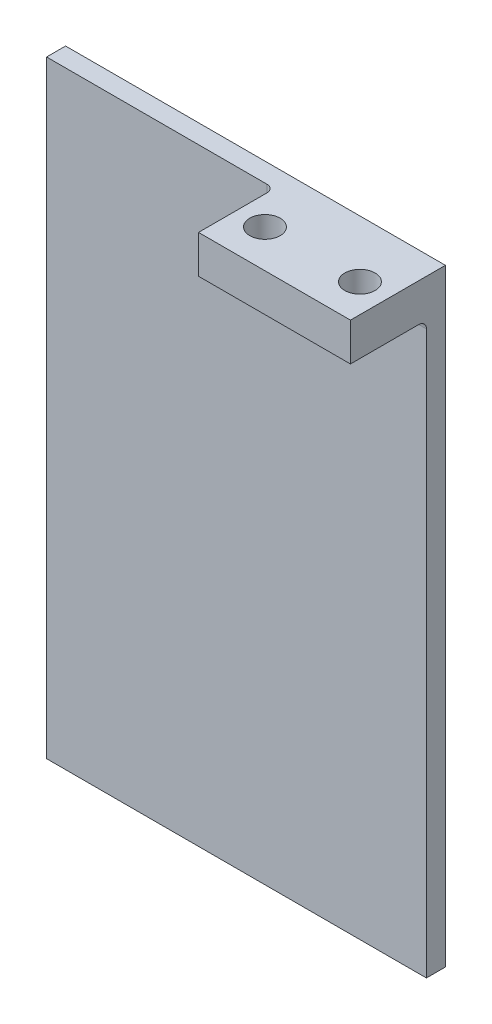
ISO-10303-21;
HEADER;
FILE_DESCRIPTION(('STEP AP214'),'2;1');
FILE_NAME('part.step','',(''),(''),'','','');
FILE_SCHEMA(('AUTOMOTIVE_DESIGN { 1 0 10303 214 1 1 1 1 }'));
ENDSEC;
DATA;
#1=APPLICATION_CONTEXT('core data for automotive mechanical design processes');
#2=APPLICATION_PROTOCOL_DEFINITION('international standard','automotive_design',2000,#1);
#3=PRODUCT_CONTEXT('',#1,'mechanical');
#4=PRODUCT('Part','Part','',(#3));
#5=PRODUCT_RELATED_PRODUCT_CATEGORY('part','',(#4));
#6=PRODUCT_DEFINITION_FORMATION('','',#4);
#7=PRODUCT_DEFINITION_CONTEXT('part definition',#1,'design');
#8=PRODUCT_DEFINITION('design','',#6,#7);
#9=PRODUCT_DEFINITION_SHAPE('','',#8);
#10=(LENGTH_UNIT() NAMED_UNIT(*) SI_UNIT(.MILLI.,.METRE.));
#11=(NAMED_UNIT(*) PLANE_ANGLE_UNIT() SI_UNIT($,.RADIAN.));
#12=(NAMED_UNIT(*) SI_UNIT($,.STERADIAN.) SOLID_ANGLE_UNIT());
#13=UNCERTAINTY_MEASURE_WITH_UNIT(LENGTH_MEASURE(1.E-05),#10,'distance_accuracy_value','');
#14=(GEOMETRIC_REPRESENTATION_CONTEXT(3) GLOBAL_UNCERTAINTY_ASSIGNED_CONTEXT((#13)) GLOBAL_UNIT_ASSIGNED_CONTEXT((#10,
#11,#12)) REPRESENTATION_CONTEXT('',''));
#15=CARTESIAN_POINT('',(0.,0.,0.));
#16=DIRECTION('',(0.,0.,1.));
#17=DIRECTION('',(1.,0.,0.));
#18=AXIS2_PLACEMENT_3D('',#15,#16,#17);
#19=CARTESIAN_POINT('',(0.,0.,5.));
#20=DIRECTION('',(0.,0.,1.));
#21=DIRECTION('',(1.,0.,0.));
#22=AXIS2_PLACEMENT_3D('',#19,#20,#21);
#23=PLANE('',#22);
#24=DIRECTION('',(-1.,0.,0.));
#25=VECTOR('',#24,1.);
#26=CARTESIAN_POINT('',(9.99999999999999,68.,5.));
#27=LINE('',#26,#25);
#28=CARTESIAN_POINT('',(50.,68.,5.));
#29=VERTEX_POINT('',#28);
#30=CARTESIAN_POINT('',(7.99999999999999,68.,5.));
#31=VERTEX_POINT('',#30);
#32=EDGE_CURVE('E181',#29,#31,#27,.T.);
#33=ORIENTED_EDGE('',*,*,#32,.T.);
#34=DIRECTION('',(0.,1.,0.));
#35=VECTOR('',#34,1.);
#36=CARTESIAN_POINT('',(7.99999999999999,80.,5.));
#37=LINE('',#36,#35);
#38=CARTESIAN_POINT('',(7.99999999999999,80.,5.));
#39=VERTEX_POINT('',#38);
#40=EDGE_CURVE('E184',#31,#39,#37,.T.);
#41=ORIENTED_EDGE('',*,*,#40,.T.);
#42=DIRECTION('',(-1.,0.,0.));
#43=VECTOR('',#42,1.);
#44=CARTESIAN_POINT('',(-50.,80.,5.));
#45=LINE('',#44,#43);
#46=CARTESIAN_POINT('',(-50.,80.,5.));
#47=VERTEX_POINT('',#46);
#48=EDGE_CURVE('E144',#39,#47,#45,.T.);
#49=ORIENTED_EDGE('',*,*,#48,.T.);
#50=DIRECTION('',(0.,-1.,0.));
#51=VECTOR('',#50,1.);
#52=CARTESIAN_POINT('',(-50.,80.,5.));
#53=LINE('',#52,#51);
#54=CARTESIAN_POINT('',(-50.,-80.,5.));
#55=VERTEX_POINT('',#54);
#56=EDGE_CURVE('E148',#47,#55,#53,.T.);
#57=ORIENTED_EDGE('',*,*,#56,.T.);
#58=DIRECTION('',(1.,0.,0.));
#59=VECTOR('',#58,1.);
#60=CARTESIAN_POINT('',(-50.,-80.,5.));
#61=LINE('',#60,#59);
#62=CARTESIAN_POINT('',(50.,-80.,5.));
#63=VERTEX_POINT('',#62);
#64=EDGE_CURVE('E151',#55,#63,#61,.T.);
#65=ORIENTED_EDGE('',*,*,#64,.T.);
#66=DIRECTION('',(0.,1.,0.));
#67=VECTOR('',#66,1.);
#68=CARTESIAN_POINT('',(50.,80.,5.));
#69=LINE('',#68,#67);
#70=EDGE_CURVE('E140',#63,#29,#69,.T.);
#71=ORIENTED_EDGE('',*,*,#70,.T.);
#72=EDGE_LOOP('',(#33,#41,#49,#57,#65,#71));
#73=FACE_BOUND('',#72,.T.);
#74=ADVANCED_FACE('F38',(#73),#23,.T.);
#75=CARTESIAN_POINT('',(50.,80.,5.));
#76=DIRECTION('',(-1.,0.,0.));
#77=DIRECTION('',(0.,0.,1.));
#78=AXIS2_PLACEMENT_3D('',#75,#76,#77);
#79=PLANE('',#78);
#80=DIRECTION('',(0.,1.,0.));
#81=VECTOR('',#80,1.);
#82=CARTESIAN_POINT('',(50.,80.,0.));
#83=LINE('',#82,#81);
#84=CARTESIAN_POINT('',(50.,-80.,0.));
#85=VERTEX_POINT('',#84);
#86=CARTESIAN_POINT('',(50.,80.,0.));
#87=VERTEX_POINT('',#86);
#88=EDGE_CURVE('E138',#85,#87,#83,.T.);
#89=ORIENTED_EDGE('',*,*,#88,.T.);
#90=DIRECTION('',(0.,0.,-1.));
#91=VECTOR('',#90,1.);
#92=CARTESIAN_POINT('',(50.,80.,5.));
#93=LINE('',#92,#91);
#94=CARTESIAN_POINT('',(50.,80.,25.));
#95=VERTEX_POINT('',#94);
#96=EDGE_CURVE('E177',#95,#87,#93,.T.);
#97=ORIENTED_EDGE('',*,*,#96,.F.);
#98=DIRECTION('',(0.,1.,0.));
#99=VECTOR('',#98,1.);
#100=CARTESIAN_POINT('',(50.,70.,25.));
#101=LINE('',#100,#99);
#102=CARTESIAN_POINT('',(50.,70.,25.));
#103=VERTEX_POINT('',#102);
#104=EDGE_CURVE('E124',#103,#95,#101,.T.);
#105=ORIENTED_EDGE('',*,*,#104,.F.);
#106=DIRECTION('',(0.,0.,-1.));
#107=VECTOR('',#106,1.);
#108=CARTESIAN_POINT('',(50.,70.,5.));
#109=LINE('',#108,#107);
#110=CARTESIAN_POINT('',(50.,70.,7.));
#111=VERTEX_POINT('',#110);
#112=EDGE_CURVE('E115',#103,#111,#109,.T.);
#113=ORIENTED_EDGE('',*,*,#112,.T.);
#114=CARTESIAN_POINT('',(50.,68.,7.));
#115=DIRECTION('',(-1.,0.,0.));
#116=DIRECTION('',(0.,0.,1.));
#117=AXIS2_PLACEMENT_3D('',#114,#115,#116);
#118=CIRCLE('',#117,2.);
#119=EDGE_CURVE('E11',#111,#29,#118,.T.);
#120=ORIENTED_EDGE('',*,*,#119,.T.);
#121=ORIENTED_EDGE('',*,*,#70,.F.);
#122=DIRECTION('',(0.,0.,-1.));
#123=VECTOR('',#122,1.);
#124=CARTESIAN_POINT('',(50.,-80.,5.));
#125=LINE('',#124,#123);
#126=EDGE_CURVE('E154',#63,#85,#125,.T.);
#127=ORIENTED_EDGE('',*,*,#126,.T.);
#128=EDGE_LOOP('',(#89,#97,#105,#113,#120,#121,#127));
#129=FACE_BOUND('',#128,.T.);
#130=ADVANCED_FACE('F220',(#129),#79,.F.);
#131=CARTESIAN_POINT('',(-50.,80.,5.));
#132=DIRECTION('',(0.,-1.,0.));
#133=DIRECTION('',(0.,0.,-1.));
#134=AXIS2_PLACEMENT_3D('',#131,#132,#133);
#135=PLANE('',#134);
#136=CARTESIAN_POINT('',(17.5,80.,15.));
#137=DIRECTION('',(0.,-1.,0.));
#138=DIRECTION('',(0.,0.,-1.));
#139=AXIS2_PLACEMENT_3D('',#136,#137,#138);
#140=CIRCLE('',#139,4.);
#141=CARTESIAN_POINT('',(17.5,80.,11.));
#142=VERTEX_POINT('',#141);
#143=EDGE_CURVE('E134',#142,#142,#140,.T.);
#144=ORIENTED_EDGE('',*,*,#143,.T.);
#145=EDGE_LOOP('',(#144));
#146=FACE_BOUND('',#145,.T.);
#147=CARTESIAN_POINT('',(42.5,80.,15.));
#148=DIRECTION('',(0.,-1.,0.));
#149=DIRECTION('',(0.,0.,-1.));
#150=AXIS2_PLACEMENT_3D('',#147,#148,#149);
#151=CIRCLE('',#150,4.);
#152=CARTESIAN_POINT('',(42.5,80.,11.));
#153=VERTEX_POINT('',#152);
#154=EDGE_CURVE('E208',#153,#153,#151,.T.);
#155=ORIENTED_EDGE('',*,*,#154,.T.);
#156=EDGE_LOOP('',(#155));
#157=FACE_BOUND('',#156,.T.);
#158=DIRECTION('',(-1.,0.,0.));
#159=VECTOR('',#158,1.);
#160=CARTESIAN_POINT('',(-50.,80.,0.));
#161=LINE('',#160,#159);
#162=CARTESIAN_POINT('',(-50.,80.,0.));
#163=VERTEX_POINT('',#162);
#164=EDGE_CURVE('E158',#87,#163,#161,.T.);
#165=ORIENTED_EDGE('',*,*,#164,.T.);
#166=DIRECTION('',(0.,0.,-1.));
#167=VECTOR('',#166,1.);
#168=CARTESIAN_POINT('',(-50.,80.,5.));
#169=LINE('',#168,#167);
#170=EDGE_CURVE('E173',#47,#163,#169,.T.);
#171=ORIENTED_EDGE('',*,*,#170,.F.);
#172=ORIENTED_EDGE('',*,*,#48,.F.);
#173=CARTESIAN_POINT('',(7.99999999999999,80.,7.));
#174=DIRECTION('',(0.,-1.,0.));
#175=DIRECTION('',(0.,0.,-1.));
#176=AXIS2_PLACEMENT_3D('',#173,#174,#175);
#177=CIRCLE('',#176,2.);
#178=CARTESIAN_POINT('',(9.99999999999999,80.,7.));
#179=VERTEX_POINT('',#178);
#180=EDGE_CURVE('E48',#39,#179,#177,.T.);
#181=ORIENTED_EDGE('',*,*,#180,.T.);
#182=DIRECTION('',(0.,0.,1.));
#183=VECTOR('',#182,1.);
#184=CARTESIAN_POINT('',(9.99999999999999,80.,5.00000000000001));
#185=LINE('',#184,#183);
#186=CARTESIAN_POINT('',(10.,80.,25.));
#187=VERTEX_POINT('',#186);
#188=EDGE_CURVE('E131',#179,#187,#185,.T.);
#189=ORIENTED_EDGE('',*,*,#188,.T.);
#190=DIRECTION('',(1.,0.,0.));
#191=VECTOR('',#190,1.);
#192=CARTESIAN_POINT('',(50.,80.,25.));
#193=LINE('',#192,#191);
#194=EDGE_CURVE('E122',#187,#95,#193,.T.);
#195=ORIENTED_EDGE('',*,*,#194,.T.);
#196=ORIENTED_EDGE('',*,*,#96,.T.);
#197=EDGE_LOOP('',(#165,#171,#172,#181,#189,#195,#196));
#198=FACE_BOUND('',#197,.T.);
#199=ADVANCED_FACE('F195',(#146,#157,#198),#135,.F.);
#200=CARTESIAN_POINT('',(-50.,80.,5.));
#201=DIRECTION('',(1.,0.,0.));
#202=DIRECTION('',(0.,0.,-1.));
#203=AXIS2_PLACEMENT_3D('',#200,#201,#202);
#204=PLANE('',#203);
#205=DIRECTION('',(0.,-1.,0.));
#206=VECTOR('',#205,1.);
#207=CARTESIAN_POINT('',(-50.,80.,0.));
#208=LINE('',#207,#206);
#209=CARTESIAN_POINT('',(-50.,-80.,0.));
#210=VERTEX_POINT('',#209);
#211=EDGE_CURVE('E161',#163,#210,#208,.T.);
#212=ORIENTED_EDGE('',*,*,#211,.T.);
#213=DIRECTION('',(0.,0.,-1.));
#214=VECTOR('',#213,1.);
#215=CARTESIAN_POINT('',(-50.,-80.,5.));
#216=LINE('',#215,#214);
#217=EDGE_CURVE('E169',#55,#210,#216,.T.);
#218=ORIENTED_EDGE('',*,*,#217,.F.);
#219=ORIENTED_EDGE('',*,*,#56,.F.);
#220=ORIENTED_EDGE('',*,*,#170,.T.);
#221=EDGE_LOOP('',(#212,#218,#219,#220));
#222=FACE_BOUND('',#221,.T.);
#223=ADVANCED_FACE('F233',(#222),#204,.F.);
#224=CARTESIAN_POINT('',(-50.,-80.,5.));
#225=DIRECTION('',(0.,1.,0.));
#226=DIRECTION('',(0.,0.,1.));
#227=AXIS2_PLACEMENT_3D('',#224,#225,#226);
#228=PLANE('',#227);
#229=DIRECTION('',(1.,0.,0.));
#230=VECTOR('',#229,1.);
#231=CARTESIAN_POINT('',(-50.,-80.,0.));
#232=LINE('',#231,#230);
#233=EDGE_CURVE('E145',#210,#85,#232,.T.);
#234=ORIENTED_EDGE('',*,*,#233,.T.);
#235=ORIENTED_EDGE('',*,*,#126,.F.);
#236=ORIENTED_EDGE('',*,*,#64,.F.);
#237=ORIENTED_EDGE('',*,*,#217,.T.);
#238=EDGE_LOOP('',(#234,#235,#236,#237));
#239=FACE_BOUND('',#238,.T.);
#240=ADVANCED_FACE('F235',(#239),#228,.F.);
#241=CARTESIAN_POINT('',(0.,0.,0.));
#242=DIRECTION('',(0.,0.,1.));
#243=DIRECTION('',(1.,0.,0.));
#244=AXIS2_PLACEMENT_3D('',#241,#242,#243);
#245=PLANE('',#244);
#246=ORIENTED_EDGE('',*,*,#88,.F.);
#247=ORIENTED_EDGE('',*,*,#233,.F.);
#248=ORIENTED_EDGE('',*,*,#211,.F.);
#249=ORIENTED_EDGE('',*,*,#164,.F.);
#250=EDGE_LOOP('',(#246,#247,#248,#249));
#251=FACE_BOUND('',#250,.T.);
#252=ADVANCED_FACE('F229',(#251),#245,.F.);
#253=CARTESIAN_POINT('',(50.,70.,25.));
#254=DIRECTION('',(0.,0.,1.));
#255=DIRECTION('',(1.,0.,0.));
#256=AXIS2_PLACEMENT_3D('',#253,#254,#255);
#257=PLANE('',#256);
#258=ORIENTED_EDGE('',*,*,#194,.F.);
#259=DIRECTION('',(0.,1.,0.));
#260=VECTOR('',#259,1.);
#261=CARTESIAN_POINT('',(10.,70.,25.));
#262=LINE('',#261,#260);
#263=CARTESIAN_POINT('',(10.,70.,25.));
#264=VERTEX_POINT('',#263);
#265=EDGE_CURVE('E110',#264,#187,#262,.T.);
#266=ORIENTED_EDGE('',*,*,#265,.F.);
#267=DIRECTION('',(1.,0.,0.));
#268=VECTOR('',#267,1.);
#269=CARTESIAN_POINT('',(50.,70.,25.));
#270=LINE('',#269,#268);
#271=EDGE_CURVE('E114',#264,#103,#270,.T.);
#272=ORIENTED_EDGE('',*,*,#271,.T.);
#273=ORIENTED_EDGE('',*,*,#104,.T.);
#274=EDGE_LOOP('',(#258,#266,#272,#273));
#275=FACE_BOUND('',#274,.T.);
#276=ADVANCED_FACE('F119',(#275),#257,.T.);
#277=CARTESIAN_POINT('',(9.99999999999999,70.,5.00000000000001));
#278=DIRECTION('',(-1.,0.,0.));
#279=DIRECTION('',(0.,0.,1.));
#280=AXIS2_PLACEMENT_3D('',#277,#278,#279);
#281=PLANE('',#280);
#282=ORIENTED_EDGE('',*,*,#188,.F.);
#283=DIRECTION('',(0.,1.,0.));
#284=VECTOR('',#283,1.);
#285=CARTESIAN_POINT('',(9.99999999999999,70.,7.));
#286=LINE('',#285,#284);
#287=CARTESIAN_POINT('',(9.99999999999999,70.,7.));
#288=VERTEX_POINT('',#287);
#289=EDGE_CURVE('E63',#179,#288,#286,.F.);
#290=ORIENTED_EDGE('',*,*,#289,.T.);
#291=DIRECTION('',(0.,0.,1.));
#292=VECTOR('',#291,1.);
#293=CARTESIAN_POINT('',(9.99999999999999,70.,5.00000000000001));
#294=LINE('',#293,#292);
#295=EDGE_CURVE('E107',#288,#264,#294,.T.);
#296=ORIENTED_EDGE('',*,*,#295,.T.);
#297=ORIENTED_EDGE('',*,*,#265,.T.);
#298=EDGE_LOOP('',(#282,#290,#296,#297));
#299=FACE_BOUND('',#298,.T.);
#300=ADVANCED_FACE('F109',(#299),#281,.T.);
#301=CARTESIAN_POINT('',(0.,70.,0.));
#302=DIRECTION('',(0.,-1.,0.));
#303=DIRECTION('',(0.,0.,-1.));
#304=AXIS2_PLACEMENT_3D('',#301,#302,#303);
#305=PLANE('',#304);
#306=CARTESIAN_POINT('',(17.5,70.,15.));
#307=DIRECTION('',(0.,-1.,0.));
#308=DIRECTION('',(0.,0.,-1.));
#309=AXIS2_PLACEMENT_3D('',#306,#307,#308);
#310=CIRCLE('',#309,4.);
#311=CARTESIAN_POINT('',(17.5,70.,11.));
#312=VERTEX_POINT('',#311);
#313=EDGE_CURVE('E214',#312,#312,#310,.T.);
#314=ORIENTED_EDGE('',*,*,#313,.F.);
#315=EDGE_LOOP('',(#314));
#316=FACE_BOUND('',#315,.T.);
#317=CARTESIAN_POINT('',(42.5,70.,15.));
#318=DIRECTION('',(0.,-1.,0.));
#319=DIRECTION('',(0.,0.,-1.));
#320=AXIS2_PLACEMENT_3D('',#317,#318,#319);
#321=CIRCLE('',#320,4.);
#322=CARTESIAN_POINT('',(42.5,70.,11.));
#323=VERTEX_POINT('',#322);
#324=EDGE_CURVE('E205',#323,#323,#321,.T.);
#325=ORIENTED_EDGE('',*,*,#324,.F.);
#326=EDGE_LOOP('',(#325));
#327=FACE_BOUND('',#326,.T.);
#328=ORIENTED_EDGE('',*,*,#295,.F.);
#329=DIRECTION('',(-1.,0.,0.));
#330=VECTOR('',#329,1.);
#331=CARTESIAN_POINT('',(50.,70.,7.));
#332=LINE('',#331,#330);
#333=EDGE_CURVE('E55',#288,#111,#332,.F.);
#334=ORIENTED_EDGE('',*,*,#333,.T.);
#335=ORIENTED_EDGE('',*,*,#112,.F.);
#336=ORIENTED_EDGE('',*,*,#271,.F.);
#337=EDGE_LOOP('',(#328,#334,#335,#336));
#338=FACE_BOUND('',#337,.T.);
#339=ADVANCED_FACE('F126',(#316,#327,#338),#305,.T.);
#340=CARTESIAN_POINT('',(42.5,80.,15.));
#341=DIRECTION('',(0.,-1.,0.));
#342=DIRECTION('',(0.,0.,-1.));
#343=AXIS2_PLACEMENT_3D('',#340,#341,#342);
#344=CYLINDRICAL_SURFACE('',#343,4.);
#345=ORIENTED_EDGE('',*,*,#154,.F.);
#346=EDGE_LOOP('',(#345));
#347=FACE_BOUND('',#346,.T.);
#348=ORIENTED_EDGE('',*,*,#324,.T.);
#349=EDGE_LOOP('',(#348));
#350=FACE_BOUND('',#349,.T.);
#351=ADVANCED_FACE('F258',(#347,#350),#344,.F.);
#352=CARTESIAN_POINT('',(17.5,80.,15.));
#353=DIRECTION('',(0.,-1.,0.));
#354=DIRECTION('',(0.,0.,-1.));
#355=AXIS2_PLACEMENT_3D('',#352,#353,#354);
#356=CYLINDRICAL_SURFACE('',#355,4.);
#357=ORIENTED_EDGE('',*,*,#143,.F.);
#358=EDGE_LOOP('',(#357));
#359=FACE_BOUND('',#358,.T.);
#360=ORIENTED_EDGE('',*,*,#313,.T.);
#361=EDGE_LOOP('',(#360));
#362=FACE_BOUND('',#361,.T.);
#363=ADVANCED_FACE('F262',(#359,#362),#356,.F.);
#364=CARTESIAN_POINT('',(0.,68.,7.));
#365=DIRECTION('',(1.,0.,0.));
#366=DIRECTION('',(0.,0.,-1.));
#367=AXIS2_PLACEMENT_3D('',#364,#365,#366);
#368=CYLINDRICAL_SURFACE('',#367,2.);
#369=ORIENTED_EDGE('',*,*,#119,.F.);
#370=ORIENTED_EDGE('',*,*,#333,.F.);
#371=CARTESIAN_POINT('',(7.99999999999999,68.,7.));
#372=DIRECTION('',(0.707106781186547,-0.707106781186547,0.));
#373=DIRECTION('',(0.707106781186547,0.707106781186547,0.));
#374=AXIS2_PLACEMENT_3D('',#371,#372,#373);
#375=ELLIPSE('',#374,2.82842712474619,2.);
#376=EDGE_CURVE('E42',#31,#288,#375,.T.);
#377=ORIENTED_EDGE('',*,*,#376,.F.);
#378=ORIENTED_EDGE('',*,*,#32,.F.);
#379=EDGE_LOOP('',(#369,#370,#377,#378));
#380=FACE_BOUND('',#379,.T.);
#381=ADVANCED_FACE('F40',(#380),#368,.F.);
#382=CARTESIAN_POINT('',(7.99999999999999,0.,7.));
#383=DIRECTION('',(0.,-1.,0.));
#384=DIRECTION('',(0.,0.,-1.));
#385=AXIS2_PLACEMENT_3D('',#382,#383,#384);
#386=CYLINDRICAL_SURFACE('',#385,2.);
#387=ORIENTED_EDGE('',*,*,#376,.T.);
#388=ORIENTED_EDGE('',*,*,#289,.F.);
#389=ORIENTED_EDGE('',*,*,#180,.F.);
#390=ORIENTED_EDGE('',*,*,#40,.F.);
#391=EDGE_LOOP('',(#387,#388,#389,#390));
#392=FACE_BOUND('',#391,.T.);
#393=ADVANCED_FACE('F200',(#392),#386,.F.);
#394=CLOSED_SHELL('',(#74,#130,#199,#223,#240,#252,#276,#300,#339,#351,#363,#381,#393));
#395=MANIFOLD_SOLID_BREP('B2',#394);
#396=ADVANCED_BREP_SHAPE_REPRESENTATION('',(#18,#395),#14);
#397=SHAPE_DEFINITION_REPRESENTATION(#9,#396);
ENDSEC;
END-ISO-10303-21;
